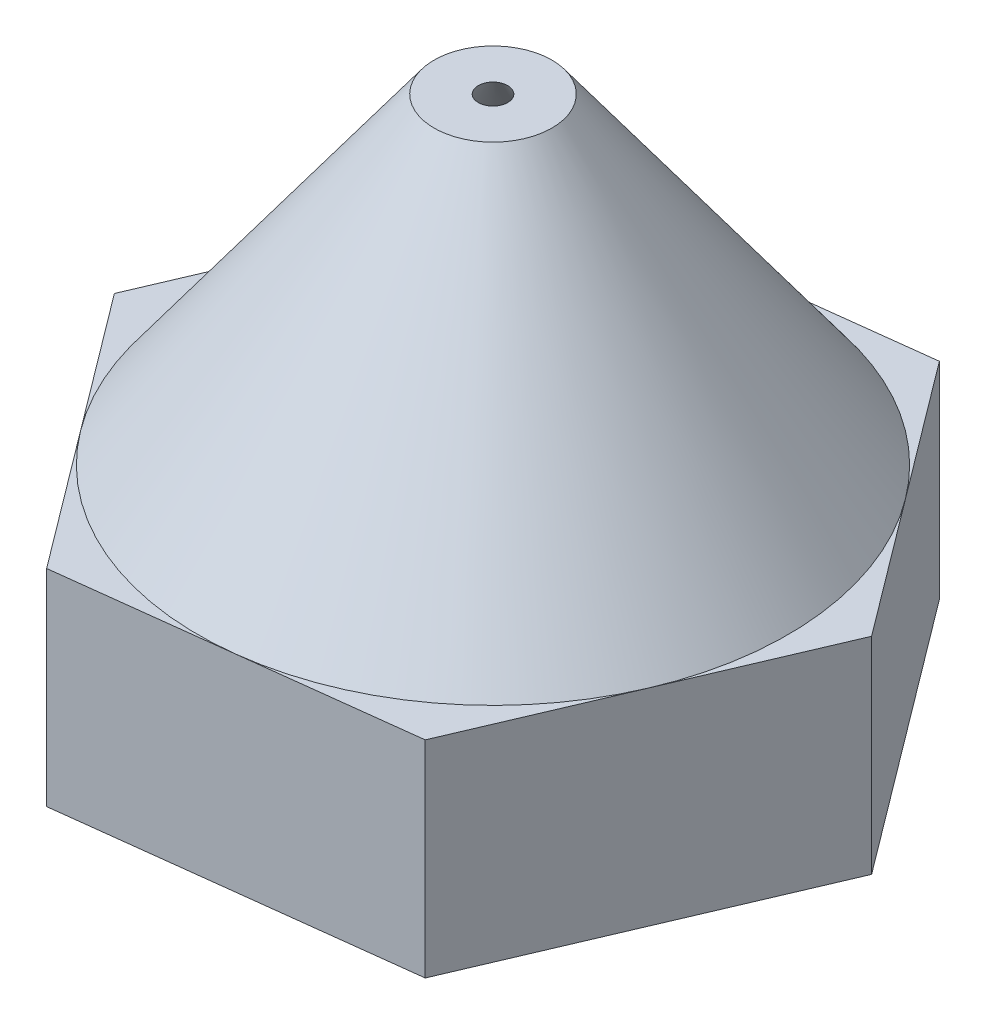
ISO-10303-21;
HEADER;
FILE_DESCRIPTION(('STEP AP214'),'2;1');
FILE_NAME('part.step','',(''),(''),'','','');
FILE_SCHEMA(('AUTOMOTIVE_DESIGN { 1 0 10303 214 1 1 1 1 }'));
ENDSEC;
DATA;
#1=APPLICATION_CONTEXT('core data for automotive mechanical design processes');
#2=APPLICATION_PROTOCOL_DEFINITION('international standard','automotive_design',2000,#1);
#3=PRODUCT_CONTEXT('',#1,'mechanical');
#4=PRODUCT('Part','Part','',(#3));
#5=PRODUCT_RELATED_PRODUCT_CATEGORY('part','',(#4));
#6=PRODUCT_DEFINITION_FORMATION('','',#4);
#7=PRODUCT_DEFINITION_CONTEXT('part definition',#1,'design');
#8=PRODUCT_DEFINITION('design','',#6,#7);
#9=PRODUCT_DEFINITION_SHAPE('','',#8);
#10=(LENGTH_UNIT() NAMED_UNIT(*) SI_UNIT(.MILLI.,.METRE.));
#11=(NAMED_UNIT(*) PLANE_ANGLE_UNIT() SI_UNIT($,.RADIAN.));
#12=(NAMED_UNIT(*) SI_UNIT($,.STERADIAN.) SOLID_ANGLE_UNIT());
#13=UNCERTAINTY_MEASURE_WITH_UNIT(LENGTH_MEASURE(1.E-05),#10,'distance_accuracy_value','');
#14=(GEOMETRIC_REPRESENTATION_CONTEXT(3) GLOBAL_UNCERTAINTY_ASSIGNED_CONTEXT((#13)) GLOBAL_UNIT_ASSIGNED_CONTEXT((#10,
#11,#12)) REPRESENTATION_CONTEXT('',''));
#15=CARTESIAN_POINT('',(0.,0.,0.));
#16=DIRECTION('',(0.,0.,1.));
#17=DIRECTION('',(1.,0.,0.));
#18=AXIS2_PLACEMENT_3D('',#15,#16,#17);
#19=CARTESIAN_POINT('',(0.,0.,0.));
#20=DIRECTION('',(0.,-1.,0.));
#21=DIRECTION('',(0.,0.,-1.));
#22=AXIS2_PLACEMENT_3D('',#19,#20,#21);
#23=CONICAL_SURFACE('',#22,5.,0.633146449295345);
#24=CARTESIAN_POINT('',(0.,5.45,0.));
#25=DIRECTION('',(0.,-1.,0.));
#26=DIRECTION('',(0.,0.,-1.));
#27=AXIS2_PLACEMENT_3D('',#24,#25,#26);
#28=CIRCLE('',#27,1.);
#29=CARTESIAN_POINT('',(0.,5.45,-1.));
#30=VERTEX_POINT('',#29);
#31=EDGE_CURVE('E144',#30,#30,#28,.T.);
#32=ORIENTED_EDGE('',*,*,#31,.T.);
#33=EDGE_LOOP('',(#32));
#34=FACE_BOUND('',#33,.T.);
#35=CARTESIAN_POINT('',(0.,0.,0.));
#36=DIRECTION('',(0.,-1.,0.));
#37=DIRECTION('',(0.,0.,-1.));
#38=AXIS2_PLACEMENT_3D('',#35,#36,#37);
#39=CIRCLE('',#38,5.);
#40=CARTESIAN_POINT('',(3.99826202050634,0.,-3.00231590865728));
#41=VERTEX_POINT('',#40);
#42=CARTESIAN_POINT('',(4.59921285733653,0.,1.96143852641635));
#43=VERTEX_POINT('',#42);
#44=EDGE_CURVE('E11',#41,#43,#39,.T.);
#45=ORIENTED_EDGE('',*,*,#44,.F.);
#46=CARTESIAN_POINT('',(-0.600950836830196,0.,-4.96375443507363));
#47=VERTEX_POINT('',#46);
#48=EDGE_CURVE('E43',#47,#41,#39,.T.);
#49=ORIENTED_EDGE('',*,*,#48,.F.);
#50=CARTESIAN_POINT('',(-4.59921285733653,0.,-1.96143852641635));
#51=VERTEX_POINT('',#50);
#52=EDGE_CURVE('E53',#51,#47,#39,.T.);
#53=ORIENTED_EDGE('',*,*,#52,.F.);
#54=CARTESIAN_POINT('',(-3.99826202050634,0.,3.00231590865728));
#55=VERTEX_POINT('',#54);
#56=EDGE_CURVE('E151',#55,#51,#39,.T.);
#57=ORIENTED_EDGE('',*,*,#56,.F.);
#58=CARTESIAN_POINT('',(0.600950836830195,0.,4.96375443507363));
#59=VERTEX_POINT('',#58);
#60=EDGE_CURVE('E155',#59,#55,#39,.T.);
#61=ORIENTED_EDGE('',*,*,#60,.F.);
#62=EDGE_CURVE('E42',#43,#59,#39,.T.);
#63=ORIENTED_EDGE('',*,*,#62,.F.);
#64=EDGE_LOOP('',(#45,#49,#53,#57,#61,#63));
#65=FACE_BOUND('',#64,.T.);
#66=ADVANCED_FACE('F35',(#34,#65),#23,.T.);
#67=CARTESIAN_POINT('',(0.,5.45,0.));
#68=DIRECTION('',(0.,1.,0.));
#69=DIRECTION('',(0.,0.,1.));
#70=AXIS2_PLACEMENT_3D('',#67,#68,#69);
#71=PLANE('',#70);
#72=CARTESIAN_POINT('',(0.,5.45,0.));
#73=DIRECTION('',(0.,-1.,0.));
#74=DIRECTION('',(0.,0.,-1.));
#75=AXIS2_PLACEMENT_3D('',#72,#73,#74);
#76=CIRCLE('',#75,0.25);
#77=CARTESIAN_POINT('',(0.,5.45,-0.25));
#78=VERTEX_POINT('',#77);
#79=EDGE_CURVE('E134',#78,#78,#76,.T.);
#80=ORIENTED_EDGE('',*,*,#79,.T.);
#81=EDGE_LOOP('',(#80));
#82=FACE_BOUND('',#81,.T.);
#83=ORIENTED_EDGE('',*,*,#31,.F.);
#84=EDGE_LOOP('',(#83));
#85=FACE_BOUND('',#84,.T.);
#86=ADVANCED_FACE('F236',(#82,#85),#71,.T.);
#87=CARTESIAN_POINT('',(0.,0.,0.));
#88=DIRECTION('',(0.,-1.,0.));
#89=DIRECTION('',(0.,0.,-1.));
#90=AXIS2_PLACEMENT_3D('',#87,#88,#89);
#91=CYLINDRICAL_SURFACE('',#90,1.65);
#92=CARTESIAN_POINT('',(0.,2.4,0.));
#93=DIRECTION('',(0.,-1.,0.));
#94=DIRECTION('',(0.,0.,-1.));
#95=AXIS2_PLACEMENT_3D('',#92,#93,#94);
#96=CIRCLE('',#95,1.65);
#97=CARTESIAN_POINT('',(0.,2.4,-1.65));
#98=VERTEX_POINT('',#97);
#99=EDGE_CURVE('E142',#98,#98,#96,.T.);
#100=ORIENTED_EDGE('',*,*,#99,.T.);
#101=EDGE_LOOP('',(#100));
#102=FACE_BOUND('',#101,.T.);
#103=CARTESIAN_POINT('',(0.,3.4,0.));
#104=DIRECTION('',(0.,-1.,0.));
#105=DIRECTION('',(0.,0.,-1.));
#106=AXIS2_PLACEMENT_3D('',#103,#104,#105);
#107=CIRCLE('',#106,1.65);
#108=CARTESIAN_POINT('',(0.,3.4,-1.65));
#109=VERTEX_POINT('',#108);
#110=EDGE_CURVE('E131',#109,#109,#107,.T.);
#111=ORIENTED_EDGE('',*,*,#110,.F.);
#112=EDGE_LOOP('',(#111));
#113=FACE_BOUND('',#112,.T.);
#114=ADVANCED_FACE('F240',(#102,#113),#91,.F.);
#115=CARTESIAN_POINT('',(0.,2.4,0.));
#116=DIRECTION('',(0.,-1.,0.));
#117=DIRECTION('',(0.,0.,-1.));
#118=AXIS2_PLACEMENT_3D('',#115,#116,#117);
#119=CONICAL_SURFACE('',#118,1.65,0.512389460310738);
#120=CARTESIAN_POINT('',(0.,0.,0.));
#121=DIRECTION('',(0.,-1.,0.));
#122=DIRECTION('',(0.,0.,-1.));
#123=AXIS2_PLACEMENT_3D('',#120,#121,#122);
#124=CIRCLE('',#123,3.);
#125=CARTESIAN_POINT('',(0.,0.,-3.));
#126=VERTEX_POINT('',#125);
#127=EDGE_CURVE('E213',#126,#126,#124,.T.);
#128=ORIENTED_EDGE('',*,*,#127,.T.);
#129=EDGE_LOOP('',(#128));
#130=FACE_BOUND('',#129,.T.);
#131=ORIENTED_EDGE('',*,*,#99,.F.);
#132=EDGE_LOOP('',(#131));
#133=FACE_BOUND('',#132,.T.);
#134=ADVANCED_FACE('F221',(#130,#133),#119,.F.);
#135=CARTESIAN_POINT('',(0.,3.4,0.));
#136=DIRECTION('',(0.,-1.,0.));
#137=DIRECTION('',(0.,0.,-1.));
#138=AXIS2_PLACEMENT_3D('',#135,#136,#137);
#139=CONICAL_SURFACE('',#138,1.65,0.599175322986307);
#140=CARTESIAN_POINT('',(0.,5.45,-0.25));
#141=CARTESIAN_POINT('',(0.,5.42864583333333,-0.264583333333333));
#142=CARTESIAN_POINT('',(0.,5.40729166666667,-0.279166666666666));
#143=CARTESIAN_POINT('',(0.,5.36458333333333,-0.308333333333333));
#144=CARTESIAN_POINT('',(0.,5.34322916666667,-0.322916666666666));
#145=CARTESIAN_POINT('',(0.,5.30052083333333,-0.352083333333333));
#146=CARTESIAN_POINT('',(0.,5.27916666666667,-0.366666666666666));
#147=CARTESIAN_POINT('',(0.,5.23645833333333,-0.395833333333333));
#148=CARTESIAN_POINT('',(0.,5.21510416666667,-0.410416666666666));
#149=CARTESIAN_POINT('',(0.,5.17239583333333,-0.439583333333333));
#150=CARTESIAN_POINT('',(0.,5.15104166666667,-0.454166666666666));
#151=CARTESIAN_POINT('',(0.,5.10833333333333,-0.483333333333333));
#152=CARTESIAN_POINT('',(0.,5.08697916666667,-0.497916666666666));
#153=CARTESIAN_POINT('',(0.,5.04427083333333,-0.527083333333333));
#154=CARTESIAN_POINT('',(0.,5.02291666666667,-0.541666666666666));
#155=CARTESIAN_POINT('',(0.,4.98020833333333,-0.570833333333333));
#156=CARTESIAN_POINT('',(0.,4.95885416666667,-0.585416666666666));
#157=CARTESIAN_POINT('',(0.,4.91614583333333,-0.614583333333333));
#158=CARTESIAN_POINT('',(0.,4.89479166666667,-0.629166666666666));
#159=CARTESIAN_POINT('',(0.,4.85208333333333,-0.658333333333333));
#160=CARTESIAN_POINT('',(0.,4.83072916666667,-0.672916666666666));
#161=CARTESIAN_POINT('',(0.,4.78802083333333,-0.702083333333333));
#162=CARTESIAN_POINT('',(0.,4.76666666666667,-0.716666666666667));
#163=CARTESIAN_POINT('',(0.,4.72395833333333,-0.745833333333333));
#164=CARTESIAN_POINT('',(0.,4.70260416666667,-0.760416666666667));
#165=CARTESIAN_POINT('',(0.,4.65989583333333,-0.789583333333333));
#166=CARTESIAN_POINT('',(0.,4.63854166666667,-0.804166666666666));
#167=CARTESIAN_POINT('',(0.,4.59583333333333,-0.833333333333333));
#168=CARTESIAN_POINT('',(0.,4.57447916666667,-0.847916666666667));
#169=CARTESIAN_POINT('',(0.,4.53177083333333,-0.877083333333333));
#170=CARTESIAN_POINT('',(0.,4.51041666666667,-0.891666666666667));
#171=CARTESIAN_POINT('',(0.,4.46770833333333,-0.920833333333333));
#172=CARTESIAN_POINT('',(0.,4.44635416666667,-0.935416666666667));
#173=CARTESIAN_POINT('',(0.,4.40364583333333,-0.964583333333333));
#174=CARTESIAN_POINT('',(0.,4.38229166666667,-0.979166666666667));
#175=CARTESIAN_POINT('',(0.,4.33958333333333,-1.00833333333333));
#176=CARTESIAN_POINT('',(0.,4.31822916666667,-1.02291666666667));
#177=CARTESIAN_POINT('',(0.,4.27552083333333,-1.05208333333333));
#178=CARTESIAN_POINT('',(0.,4.25416666666667,-1.06666666666667));
#179=CARTESIAN_POINT('',(0.,4.21145833333333,-1.09583333333333));
#180=CARTESIAN_POINT('',(0.,4.19010416666667,-1.11041666666667));
#181=CARTESIAN_POINT('',(0.,4.14739583333333,-1.13958333333333));
#182=CARTESIAN_POINT('',(0.,4.12604166666667,-1.15416666666667));
#183=CARTESIAN_POINT('',(0.,4.08333333333333,-1.18333333333333));
#184=CARTESIAN_POINT('',(0.,4.06197916666667,-1.19791666666667));
#185=CARTESIAN_POINT('',(0.,4.01927083333333,-1.22708333333333));
#186=CARTESIAN_POINT('',(0.,3.99791666666667,-1.24166666666667));
#187=CARTESIAN_POINT('',(0.,3.95520833333333,-1.27083333333333));
#188=CARTESIAN_POINT('',(0.,3.93385416666667,-1.28541666666667));
#189=CARTESIAN_POINT('',(0.,3.89114583333333,-1.31458333333333));
#190=CARTESIAN_POINT('',(0.,3.86979166666667,-1.32916666666667));
#191=CARTESIAN_POINT('',(0.,3.82708333333333,-1.35833333333333));
#192=CARTESIAN_POINT('',(0.,3.80572916666667,-1.37291666666667));
#193=CARTESIAN_POINT('',(0.,3.76302083333333,-1.40208333333333));
#194=CARTESIAN_POINT('',(0.,3.74166666666667,-1.41666666666667));
#195=CARTESIAN_POINT('',(0.,3.69895833333333,-1.44583333333333));
#196=CARTESIAN_POINT('',(0.,3.67760416666667,-1.46041666666667));
#197=CARTESIAN_POINT('',(0.,3.63489583333333,-1.48958333333333));
#198=CARTESIAN_POINT('',(0.,3.61354166666667,-1.50416666666667));
#199=CARTESIAN_POINT('',(0.,3.57083333333333,-1.53333333333333));
#200=CARTESIAN_POINT('',(0.,3.54947916666667,-1.54791666666667));
#201=CARTESIAN_POINT('',(0.,3.50677083333333,-1.57708333333333));
#202=CARTESIAN_POINT('',(0.,3.48541666666667,-1.59166666666667));
#203=CARTESIAN_POINT('',(0.,3.44270833333333,-1.62083333333333));
#204=CARTESIAN_POINT('',(0.,3.42135416666667,-1.63541666666667));
#205=CARTESIAN_POINT('',(0.,3.4,-1.65));
#206=B_SPLINE_CURVE_WITH_KNOTS('',3,(#140,#141,#142,#143,#144,#145,#146,#147,#148,#149,#150,
#151,#152,#153,#154,#155,#156,#157,#158,#159,#160,#161,#162,#163,#164,#165,#166,#167,#168,#169,
#170,#171,#172,#173,#174,#175,#176,#177,#178,#179,#180,#181,#182,#183,#184,#185,#186,#187,#188,
#189,#190,#191,#192,#193,#194,#195,#196,#197,#198,#199,#200,#201,#202,#203,#204,#205),
.UNSPECIFIED.,.F.,.F.,(4,2,2,2,2,2,2,2,2,2,2,2,2,2,2,2,2,2,2,2,2,2,2,2,2,2,2,2,2,2,2,2,4),(0.,
0.0775761974206648,0.15515239484133,0.232728592261995,0.31030478968266,0.387880987103325,
0.46545718452399,0.543033381944655,0.62060957936532,0.698185776785985,0.77576197420665,
0.853338171627315,0.930914369047981,1.00849056646865,1.08606676388931,1.16364296130998,
1.24121915873064,1.31879535615131,1.39637155357197,1.47394775099264,1.5515239484133,
1.62910014583397,1.70667634325463,1.7842525406753,1.86182873809596,1.93940493551663,
2.01698113293729,2.09455733035796,2.17213352777862,2.24970972519929,2.32728592261995,
2.40486212004062,2.48243831746128),.UNSPECIFIED.);
#207=EDGE_CURVE('BSEAM245',#78,#109,#206,.T.);
#208=ORIENTED_EDGE('',*,*,#79,.F.);
#209=ORIENTED_EDGE('',*,*,#110,.T.);
#210=ORIENTED_EDGE('',*,*,#207,.T.);
#211=ORIENTED_EDGE('',*,*,#207,.F.);
#212=EDGE_LOOP('',(#208,#210,#209,#211));
#213=FACE_BOUND('',#212,.T.);
#214=ADVANCED_FACE('F245',(#213),#139,.F.);
#215=CARTESIAN_POINT('',(0.,0.,0.));
#216=DIRECTION('',(0.,-1.,0.));
#217=DIRECTION('',(0.,0.,-1.));
#218=AXIS2_PLACEMENT_3D('',#215,#216,#217);
#219=PLANE('',#218);
#220=DIRECTION('',(0.600463181731455,0.,0.799652404101268));
#221=VECTOR('',#220,1.);
#222=CARTESIAN_POINT('',(2.26487412245076,0.,-5.31071356248727));
#223=LINE('',#222,#221);
#224=CARTESIAN_POINT('',(5.73164991856191,0.,-0.693918254827285));
#225=VERTEX_POINT('',#224);
#226=EDGE_CURVE('E129',#41,#225,#223,.T.);
#227=ORIENTED_EDGE('',*,*,#226,.F.);
#228=ORIENTED_EDGE('',*,*,#44,.T.);
#229=DIRECTION('',(-0.39228770528327,0.,0.919842571467306));
#230=VECTOR('',#229,1.);
#231=CARTESIAN_POINT('',(5.73164991856191,0.,-0.693918254827285));
#232=LINE('',#231,#230);
#233=EDGE_CURVE('E178',#225,#43,#232,.T.);
#234=ORIENTED_EDGE('',*,*,#233,.F.);
#235=EDGE_LOOP('',(#227,#228,#234));
#236=FACE_BOUND('',#235,.T.);
#237=ADVANCED_FACE('F243',(#236),#219,.F.);
#238=CARTESIAN_POINT('',(3.46677579611115,0.,4.61679530765998));
#239=VERTEX_POINT('',#238);
#240=EDGE_CURVE('E170',#43,#239,#232,.T.);
#241=ORIENTED_EDGE('',*,*,#240,.F.);
#242=ORIENTED_EDGE('',*,*,#62,.T.);
#243=DIRECTION('',(-0.992750887014725,0.,0.120190167366039));
#244=VECTOR('',#243,1.);
#245=CARTESIAN_POINT('',(3.46677579611115,0.,4.61679530765998));
#246=LINE('',#245,#244);
#247=EDGE_CURVE('E169',#239,#59,#246,.T.);
#248=ORIENTED_EDGE('',*,*,#247,.F.);
#249=EDGE_LOOP('',(#241,#242,#248));
#250=FACE_BOUND('',#249,.T.);
#251=ADVANCED_FACE('F167',(#250),#219,.F.);
#252=CARTESIAN_POINT('',(-2.26487412245076,0.,5.31071356248727));
#253=VERTEX_POINT('',#252);
#254=EDGE_CURVE('E171',#59,#253,#246,.T.);
#255=ORIENTED_EDGE('',*,*,#254,.F.);
#256=ORIENTED_EDGE('',*,*,#60,.T.);
#257=DIRECTION('',(-0.600463181731456,0.,-0.799652404101268));
#258=VECTOR('',#257,1.);
#259=CARTESIAN_POINT('',(-2.26487412245076,0.,5.31071356248727));
#260=LINE('',#259,#258);
#261=EDGE_CURVE('E174',#253,#55,#260,.T.);
#262=ORIENTED_EDGE('',*,*,#261,.F.);
#263=EDGE_LOOP('',(#255,#256,#262));
#264=FACE_BOUND('',#263,.T.);
#265=ADVANCED_FACE('F172',(#264),#219,.F.);
#266=CARTESIAN_POINT('',(-5.73164991856191,0.,0.693918254827289));
#267=VERTEX_POINT('',#266);
#268=EDGE_CURVE('E181',#55,#267,#260,.T.);
#269=ORIENTED_EDGE('',*,*,#268,.F.);
#270=ORIENTED_EDGE('',*,*,#56,.T.);
#271=DIRECTION('',(0.392287705283269,0.,-0.919842571467307));
#272=VECTOR('',#271,1.);
#273=CARTESIAN_POINT('',(-5.73164991856191,0.,0.693918254827289));
#274=LINE('',#273,#272);
#275=EDGE_CURVE('E187',#267,#51,#274,.T.);
#276=ORIENTED_EDGE('',*,*,#275,.F.);
#277=EDGE_LOOP('',(#269,#270,#276));
#278=FACE_BOUND('',#277,.T.);
#279=ADVANCED_FACE('F260',(#278),#219,.F.);
#280=CARTESIAN_POINT('',(-3.46677579611115,0.,-4.61679530765998));
#281=VERTEX_POINT('',#280);
#282=EDGE_CURVE('E186',#51,#281,#274,.T.);
#283=ORIENTED_EDGE('',*,*,#282,.F.);
#284=ORIENTED_EDGE('',*,*,#52,.T.);
#285=DIRECTION('',(0.992750887014725,0.,-0.120190167366039));
#286=VECTOR('',#285,1.);
#287=CARTESIAN_POINT('',(-3.46677579611115,0.,-4.61679530765998));
#288=LINE('',#287,#286);
#289=EDGE_CURVE('E124',#281,#47,#288,.T.);
#290=ORIENTED_EDGE('',*,*,#289,.F.);
#291=EDGE_LOOP('',(#283,#284,#290));
#292=FACE_BOUND('',#291,.T.);
#293=ADVANCED_FACE('F255',(#292),#219,.F.);
#294=CARTESIAN_POINT('',(2.26487412245076,0.,-5.31071356248727));
#295=VERTEX_POINT('',#294);
#296=EDGE_CURVE('E190',#47,#295,#288,.T.);
#297=ORIENTED_EDGE('',*,*,#296,.F.);
#298=ORIENTED_EDGE('',*,*,#48,.T.);
#299=EDGE_CURVE('E210',#295,#41,#223,.T.);
#300=ORIENTED_EDGE('',*,*,#299,.F.);
#301=EDGE_LOOP('',(#297,#298,#300));
#302=FACE_BOUND('',#301,.T.);
#303=ADVANCED_FACE('F247',(#302),#219,.F.);
#304=CARTESIAN_POINT('',(0.,-3.5,0.));
#305=DIRECTION('',(0.,-1.,0.));
#306=DIRECTION('',(0.,0.,-1.));
#307=AXIS2_PLACEMENT_3D('',#304,#305,#306);
#308=PLANE('',#307);
#309=DIRECTION('',(0.600463181731455,0.,0.799652404101268));
#310=VECTOR('',#309,1.);
#311=CARTESIAN_POINT('',(2.26487412245076,-3.5,-5.31071356248727));
#312=LINE('',#311,#310);
#313=CARTESIAN_POINT('',(2.26487412245076,-3.5,-5.31071356248727));
#314=VERTEX_POINT('',#313);
#315=CARTESIAN_POINT('',(5.73164991856191,-3.5,-0.693918254827285));
#316=VERTEX_POINT('',#315);
#317=EDGE_CURVE('E114',#314,#316,#312,.T.);
#318=ORIENTED_EDGE('',*,*,#317,.T.);
#319=DIRECTION('',(-0.39228770528327,0.,0.919842571467306));
#320=VECTOR('',#319,1.);
#321=CARTESIAN_POINT('',(5.73164991856191,-3.5,-0.693918254827285));
#322=LINE('',#321,#320);
#323=CARTESIAN_POINT('',(3.46677579611115,-3.5,4.61679530765998));
#324=VERTEX_POINT('',#323);
#325=EDGE_CURVE('E103',#316,#324,#322,.T.);
#326=ORIENTED_EDGE('',*,*,#325,.T.);
#327=DIRECTION('',(-0.992750887014725,0.,0.120190167366039));
#328=VECTOR('',#327,1.);
#329=CARTESIAN_POINT('',(3.46677579611115,-3.5,4.61679530765998));
#330=LINE('',#329,#328);
#331=CARTESIAN_POINT('',(-2.26487412245076,-3.5,5.31071356248727));
#332=VERTEX_POINT('',#331);
#333=EDGE_CURVE('E113',#324,#332,#330,.T.);
#334=ORIENTED_EDGE('',*,*,#333,.T.);
#335=DIRECTION('',(-0.600463181731456,0.,-0.799652404101268));
#336=VECTOR('',#335,1.);
#337=CARTESIAN_POINT('',(-2.26487412245076,-3.5,5.31071356248727));
#338=LINE('',#337,#336);
#339=CARTESIAN_POINT('',(-5.73164991856191,-3.5,0.693918254827289));
#340=VERTEX_POINT('',#339);
#341=EDGE_CURVE('E204',#332,#340,#338,.T.);
#342=ORIENTED_EDGE('',*,*,#341,.T.);
#343=DIRECTION('',(0.392287705283269,0.,-0.919842571467307));
#344=VECTOR('',#343,1.);
#345=CARTESIAN_POINT('',(-5.73164991856191,-3.5,0.693918254827289));
#346=LINE('',#345,#344);
#347=CARTESIAN_POINT('',(-3.46677579611115,-3.5,-4.61679530765998));
#348=VERTEX_POINT('',#347);
#349=EDGE_CURVE('E206',#340,#348,#346,.T.);
#350=ORIENTED_EDGE('',*,*,#349,.T.);
#351=DIRECTION('',(0.992750887014725,0.,-0.120190167366039));
#352=VECTOR('',#351,1.);
#353=CARTESIAN_POINT('',(-3.46677579611115,-3.5,-4.61679530765998));
#354=LINE('',#353,#352);
#355=EDGE_CURVE('E120',#348,#314,#354,.T.);
#356=ORIENTED_EDGE('',*,*,#355,.T.);
#357=EDGE_LOOP('',(#318,#326,#334,#342,#350,#356));
#358=FACE_BOUND('',#357,.T.);
#359=CARTESIAN_POINT('',(0.,-3.5,0.));
#360=DIRECTION('',(0.,-1.,0.));
#361=DIRECTION('',(0.,0.,-1.));
#362=AXIS2_PLACEMENT_3D('',#359,#360,#361);
#363=CIRCLE('',#362,3.);
#364=CARTESIAN_POINT('',(0.,-3.5,-3.));
#365=VERTEX_POINT('',#364);
#366=EDGE_CURVE('E211',#365,#365,#363,.T.);
#367=ORIENTED_EDGE('',*,*,#366,.F.);
#368=EDGE_LOOP('',(#367));
#369=FACE_BOUND('',#368,.T.);
#370=ADVANCED_FACE('F117',(#358,#369),#308,.T.);
#371=CARTESIAN_POINT('',(2.26487412245076,-3.5,-5.31071356248727));
#372=DIRECTION('',(-0.799652404101268,0.,0.600463181731455));
#373=DIRECTION('',(0.600463181731455,0.,0.799652404101268));
#374=AXIS2_PLACEMENT_3D('',#371,#372,#373);
#375=PLANE('',#374);
#376=ORIENTED_EDGE('',*,*,#299,.T.);
#377=ORIENTED_EDGE('',*,*,#226,.T.);
#378=DIRECTION('',(0.,1.,0.));
#379=VECTOR('',#378,1.);
#380=CARTESIAN_POINT('',(5.73164991856191,-3.5,-0.693918254827285));
#381=LINE('',#380,#379);
#382=EDGE_CURVE('E108',#316,#225,#381,.T.);
#383=ORIENTED_EDGE('',*,*,#382,.F.);
#384=ORIENTED_EDGE('',*,*,#317,.F.);
#385=DIRECTION('',(0.,1.,0.));
#386=VECTOR('',#385,1.);
#387=CARTESIAN_POINT('',(2.26487412245076,-3.5,-5.31071356248727));
#388=LINE('',#387,#386);
#389=EDGE_CURVE('E193',#314,#295,#388,.T.);
#390=ORIENTED_EDGE('',*,*,#389,.T.);
#391=EDGE_LOOP('',(#376,#377,#383,#384,#390));
#392=FACE_BOUND('',#391,.T.);
#393=ADVANCED_FACE('F127',(#392),#375,.F.);
#394=CARTESIAN_POINT('',(5.73164991856191,-3.5,-0.693918254827285));
#395=DIRECTION('',(-0.919842571467306,0.,-0.39228770528327));
#396=DIRECTION('',(-0.39228770528327,0.,0.919842571467307));
#397=AXIS2_PLACEMENT_3D('',#394,#395,#396);
#398=PLANE('',#397);
#399=ORIENTED_EDGE('',*,*,#233,.T.);
#400=ORIENTED_EDGE('',*,*,#240,.T.);
#401=DIRECTION('',(0.,1.,0.));
#402=VECTOR('',#401,1.);
#403=CARTESIAN_POINT('',(3.46677579611115,-3.5,4.61679530765998));
#404=LINE('',#403,#402);
#405=EDGE_CURVE('E110',#324,#239,#404,.T.);
#406=ORIENTED_EDGE('',*,*,#405,.F.);
#407=ORIENTED_EDGE('',*,*,#325,.F.);
#408=ORIENTED_EDGE('',*,*,#382,.T.);
#409=EDGE_LOOP('',(#399,#400,#406,#407,#408));
#410=FACE_BOUND('',#409,.T.);
#411=ADVANCED_FACE('F106',(#410),#398,.F.);
#412=CARTESIAN_POINT('',(3.46677579611115,-3.5,4.61679530765998));
#413=DIRECTION('',(-0.120190167366039,0.,-0.992750887014725));
#414=DIRECTION('',(-0.992750887014725,0.,0.120190167366039));
#415=AXIS2_PLACEMENT_3D('',#412,#413,#414);
#416=PLANE('',#415);
#417=ORIENTED_EDGE('',*,*,#247,.T.);
#418=ORIENTED_EDGE('',*,*,#254,.T.);
#419=DIRECTION('',(0.,1.,0.));
#420=VECTOR('',#419,1.);
#421=CARTESIAN_POINT('',(-2.26487412245076,-3.5,5.31071356248727));
#422=LINE('',#421,#420);
#423=EDGE_CURVE('E136',#332,#253,#422,.T.);
#424=ORIENTED_EDGE('',*,*,#423,.F.);
#425=ORIENTED_EDGE('',*,*,#333,.F.);
#426=ORIENTED_EDGE('',*,*,#405,.T.);
#427=EDGE_LOOP('',(#417,#418,#424,#425,#426));
#428=FACE_BOUND('',#427,.T.);
#429=ADVANCED_FACE('F180',(#428),#416,.F.);
#430=CARTESIAN_POINT('',(-2.26487412245076,-3.5,5.31071356248727));
#431=DIRECTION('',(0.799652404101268,0.,-0.600463181731456));
#432=DIRECTION('',(-0.600463181731456,0.,-0.799652404101268));
#433=AXIS2_PLACEMENT_3D('',#430,#431,#432);
#434=PLANE('',#433);
#435=ORIENTED_EDGE('',*,*,#261,.T.);
#436=ORIENTED_EDGE('',*,*,#268,.T.);
#437=DIRECTION('',(0.,1.,0.));
#438=VECTOR('',#437,1.);
#439=CARTESIAN_POINT('',(-5.73164991856191,-3.5,0.693918254827289));
#440=LINE('',#439,#438);
#441=EDGE_CURVE('E198',#340,#267,#440,.T.);
#442=ORIENTED_EDGE('',*,*,#441,.F.);
#443=ORIENTED_EDGE('',*,*,#341,.F.);
#444=ORIENTED_EDGE('',*,*,#423,.T.);
#445=EDGE_LOOP('',(#435,#436,#442,#443,#444));
#446=FACE_BOUND('',#445,.T.);
#447=ADVANCED_FACE('F202',(#446),#434,.F.);
#448=CARTESIAN_POINT('',(-5.73164991856191,-3.5,0.693918254827289));
#449=DIRECTION('',(0.919842571467307,0.,0.392287705283269));
#450=DIRECTION('',(0.392287705283269,0.,-0.919842571467307));
#451=AXIS2_PLACEMENT_3D('',#448,#449,#450);
#452=PLANE('',#451);
#453=ORIENTED_EDGE('',*,*,#275,.T.);
#454=ORIENTED_EDGE('',*,*,#282,.T.);
#455=DIRECTION('',(0.,1.,0.));
#456=VECTOR('',#455,1.);
#457=CARTESIAN_POINT('',(-3.46677579611115,-3.5,-4.61679530765998));
#458=LINE('',#457,#456);
#459=EDGE_CURVE('E195',#348,#281,#458,.T.);
#460=ORIENTED_EDGE('',*,*,#459,.F.);
#461=ORIENTED_EDGE('',*,*,#349,.F.);
#462=ORIENTED_EDGE('',*,*,#441,.T.);
#463=EDGE_LOOP('',(#453,#454,#460,#461,#462));
#464=FACE_BOUND('',#463,.T.);
#465=ADVANCED_FACE('F231',(#464),#452,.F.);
#466=CARTESIAN_POINT('',(-3.46677579611115,-3.5,-4.61679530765998));
#467=DIRECTION('',(0.120190167366039,0.,0.992750887014725));
#468=DIRECTION('',(0.992750887014725,0.,-0.120190167366039));
#469=AXIS2_PLACEMENT_3D('',#466,#467,#468);
#470=PLANE('',#469);
#471=ORIENTED_EDGE('',*,*,#289,.T.);
#472=ORIENTED_EDGE('',*,*,#296,.T.);
#473=ORIENTED_EDGE('',*,*,#389,.F.);
#474=ORIENTED_EDGE('',*,*,#355,.F.);
#475=ORIENTED_EDGE('',*,*,#459,.T.);
#476=EDGE_LOOP('',(#471,#472,#473,#474,#475));
#477=FACE_BOUND('',#476,.T.);
#478=ADVANCED_FACE('F226',(#477),#470,.F.);
#479=CARTESIAN_POINT('',(0.,-3.5,0.));
#480=DIRECTION('',(0.,1.,0.));
#481=DIRECTION('',(0.,0.,1.));
#482=AXIS2_PLACEMENT_3D('',#479,#480,#481);
#483=CYLINDRICAL_SURFACE('',#482,3.);
#484=ORIENTED_EDGE('',*,*,#366,.T.);
#485=EDGE_LOOP('',(#484));
#486=FACE_BOUND('',#485,.T.);
#487=ORIENTED_EDGE('',*,*,#127,.F.);
#488=EDGE_LOOP('',(#487));
#489=FACE_BOUND('',#488,.T.);
#490=ADVANCED_FACE('F224',(#486,#489),#483,.F.);
#491=CLOSED_SHELL('',(#66,#86,#114,#134,#214,#237,#251,#265,#279,#293,#303,#370,#393,#411,#429,
#447,#465,#478,#490));
#492=MANIFOLD_SOLID_BREP('B2',#491);
#493=ADVANCED_BREP_SHAPE_REPRESENTATION('',(#18,#492),#14);
#494=SHAPE_DEFINITION_REPRESENTATION(#9,#493);
ENDSEC;
END-ISO-10303-21;
